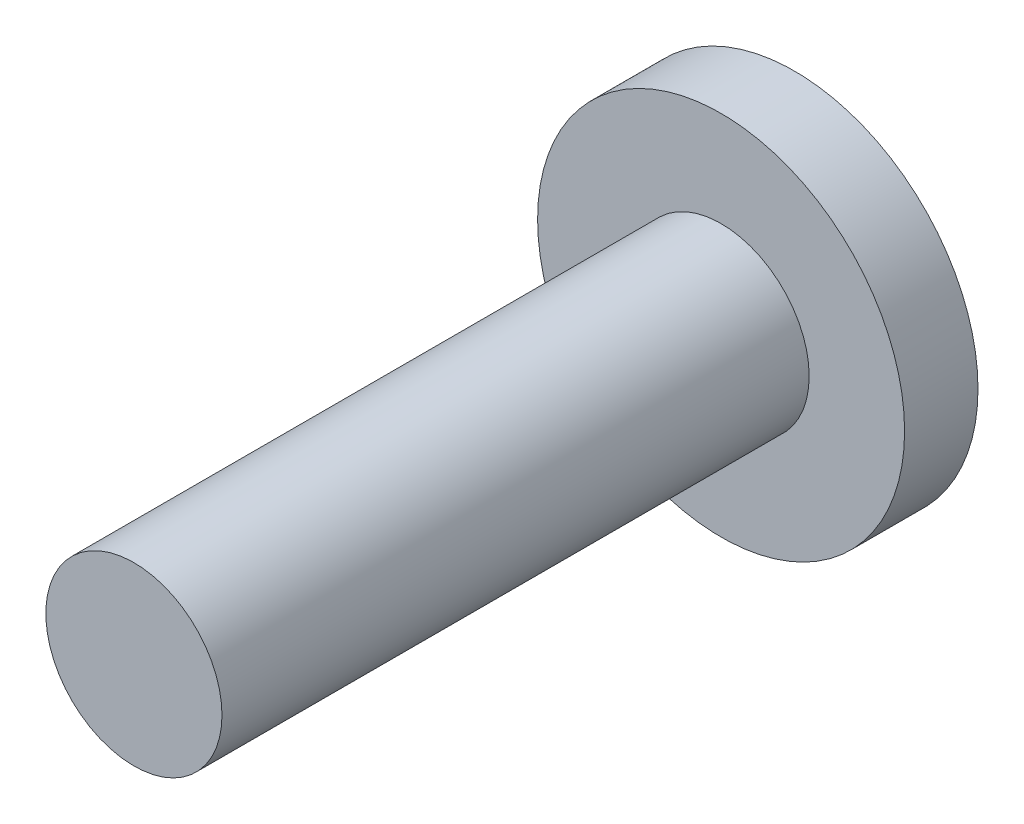
ISO-10303-21;
HEADER;
FILE_DESCRIPTION(('STEP AP214'),'2;1');
FILE_NAME('part.step','',(''),(''),'','','');
FILE_SCHEMA(('AUTOMOTIVE_DESIGN { 1 0 10303 214 1 1 1 1 }'));
ENDSEC;
DATA;
#1=APPLICATION_CONTEXT('core data for automotive mechanical design processes');
#2=APPLICATION_PROTOCOL_DEFINITION('international standard','automotive_design',2000,#1);
#3=PRODUCT_CONTEXT('',#1,'mechanical');
#4=PRODUCT('Part','Part','',(#3));
#5=PRODUCT_RELATED_PRODUCT_CATEGORY('part','',(#4));
#6=PRODUCT_DEFINITION_FORMATION('','',#4);
#7=PRODUCT_DEFINITION_CONTEXT('part definition',#1,'design');
#8=PRODUCT_DEFINITION('design','',#6,#7);
#9=PRODUCT_DEFINITION_SHAPE('','',#8);
#10=(LENGTH_UNIT() NAMED_UNIT(*) SI_UNIT(.MILLI.,.METRE.));
#11=(NAMED_UNIT(*) PLANE_ANGLE_UNIT() SI_UNIT($,.RADIAN.));
#12=(NAMED_UNIT(*) SI_UNIT($,.STERADIAN.) SOLID_ANGLE_UNIT());
#13=UNCERTAINTY_MEASURE_WITH_UNIT(LENGTH_MEASURE(1.E-05),#10,'distance_accuracy_value','');
#14=(GEOMETRIC_REPRESENTATION_CONTEXT(3) GLOBAL_UNCERTAINTY_ASSIGNED_CONTEXT((#13)) GLOBAL_UNIT_ASSIGNED_CONTEXT((#10,
#11,#12)) REPRESENTATION_CONTEXT('',''));
#15=CARTESIAN_POINT('',(0.,0.,0.));
#16=DIRECTION('',(0.,0.,1.));
#17=DIRECTION('',(1.,0.,0.));
#18=AXIS2_PLACEMENT_3D('',#15,#16,#17);
#19=CARTESIAN_POINT('',(0.,0.,2.5));
#20=DIRECTION('',(0.,0.,-1.));
#21=DIRECTION('',(-1.,0.,0.));
#22=AXIS2_PLACEMENT_3D('',#19,#20,#21);
#23=CYLINDRICAL_SURFACE('',#22,6.25);
#24=CARTESIAN_POINT('',(0.,0.,2.5));
#25=DIRECTION('',(0.,0.,1.));
#26=DIRECTION('',(1.,0.,0.));
#27=AXIS2_PLACEMENT_3D('',#24,#25,#26);
#28=CIRCLE('',#27,6.25);
#29=CARTESIAN_POINT('',(6.25,0.,2.5));
#30=VERTEX_POINT('',#29);
#31=EDGE_CURVE('E49',#30,#30,#28,.T.);
#32=ORIENTED_EDGE('',*,*,#31,.F.);
#33=EDGE_LOOP('',(#32));
#34=FACE_BOUND('',#33,.T.);
#35=CARTESIAN_POINT('',(0.,0.,0.));
#36=DIRECTION('',(0.,0.,1.));
#37=DIRECTION('',(1.,0.,0.));
#38=AXIS2_PLACEMENT_3D('',#35,#36,#37);
#39=CIRCLE('',#38,6.25);
#40=CARTESIAN_POINT('',(6.25,0.,0.));
#41=VERTEX_POINT('',#40);
#42=EDGE_CURVE('E44',#41,#41,#39,.T.);
#43=ORIENTED_EDGE('',*,*,#42,.T.);
#44=EDGE_LOOP('',(#43));
#45=FACE_BOUND('',#44,.T.);
#46=ADVANCED_FACE('F41',(#34,#45),#23,.T.);
#47=CARTESIAN_POINT('',(0.,0.,2.5));
#48=DIRECTION('',(0.,0.,1.));
#49=DIRECTION('',(1.,0.,0.));
#50=AXIS2_PLACEMENT_3D('',#47,#48,#49);
#51=PLANE('',#50);
#52=CARTESIAN_POINT('',(0.,0.,2.5));
#53=DIRECTION('',(0.,0.,1.));
#54=DIRECTION('',(1.,0.,0.));
#55=AXIS2_PLACEMENT_3D('',#52,#53,#54);
#56=CIRCLE('',#55,3.);
#57=CARTESIAN_POINT('',(3.,0.,2.5));
#58=VERTEX_POINT('',#57);
#59=EDGE_CURVE('E11',#58,#58,#56,.T.);
#60=ORIENTED_EDGE('',*,*,#59,.F.);
#61=EDGE_LOOP('',(#60));
#62=FACE_BOUND('',#61,.T.);
#63=ORIENTED_EDGE('',*,*,#31,.T.);
#64=EDGE_LOOP('',(#63));
#65=FACE_BOUND('',#64,.T.);
#66=ADVANCED_FACE('F161',(#62,#65),#51,.T.);
#67=CARTESIAN_POINT('',(0.,0.,0.));
#68=DIRECTION('',(0.,0.,1.));
#69=DIRECTION('',(1.,0.,0.));
#70=AXIS2_PLACEMENT_3D('',#67,#68,#69);
#71=PLANE('',#70);
#72=DIRECTION('',(0.5,0.866025403784439,0.));
#73=VECTOR('',#72,1.);
#74=CARTESIAN_POINT('',(-2.3094010767585,0.,0.));
#75=LINE('',#74,#73);
#76=CARTESIAN_POINT('',(-2.3094010767585,0.,0.));
#77=VERTEX_POINT('',#76);
#78=CARTESIAN_POINT('',(-1.15470053837925,2.,0.));
#79=VERTEX_POINT('',#78);
#80=EDGE_CURVE('E131',#77,#79,#75,.T.);
#81=ORIENTED_EDGE('',*,*,#80,.F.);
#82=DIRECTION('',(-0.5,0.866025403784439,0.));
#83=VECTOR('',#82,1.);
#84=CARTESIAN_POINT('',(-1.15470053837925,-2.,0.));
#85=LINE('',#84,#83);
#86=CARTESIAN_POINT('',(-1.15470053837925,-2.,0.));
#87=VERTEX_POINT('',#86);
#88=EDGE_CURVE('E57',#87,#77,#85,.T.);
#89=ORIENTED_EDGE('',*,*,#88,.F.);
#90=DIRECTION('',(-1.,0.,0.));
#91=VECTOR('',#90,1.);
#92=CARTESIAN_POINT('',(1.15470053837925,-2.,0.));
#93=LINE('',#92,#91);
#94=CARTESIAN_POINT('',(1.15470053837925,-2.,0.));
#95=VERTEX_POINT('',#94);
#96=EDGE_CURVE('E140',#95,#87,#93,.T.);
#97=ORIENTED_EDGE('',*,*,#96,.F.);
#98=DIRECTION('',(-0.5,-0.866025403784439,0.));
#99=VECTOR('',#98,1.);
#100=CARTESIAN_POINT('',(2.3094010767585,0.,0.));
#101=LINE('',#100,#99);
#102=CARTESIAN_POINT('',(2.3094010767585,0.,0.));
#103=VERTEX_POINT('',#102);
#104=EDGE_CURVE('E138',#103,#95,#101,.T.);
#105=ORIENTED_EDGE('',*,*,#104,.F.);
#106=DIRECTION('',(0.5,-0.866025403784439,0.));
#107=VECTOR('',#106,1.);
#108=CARTESIAN_POINT('',(1.15470053837925,2.,0.));
#109=LINE('',#108,#107);
#110=CARTESIAN_POINT('',(1.15470053837925,2.,0.));
#111=VERTEX_POINT('',#110);
#112=EDGE_CURVE('E105',#111,#103,#109,.T.);
#113=ORIENTED_EDGE('',*,*,#112,.F.);
#114=DIRECTION('',(1.,0.,0.));
#115=VECTOR('',#114,1.);
#116=CARTESIAN_POINT('',(-1.15470053837925,2.,0.));
#117=LINE('',#116,#115);
#118=EDGE_CURVE('E134',#79,#111,#117,.T.);
#119=ORIENTED_EDGE('',*,*,#118,.F.);
#120=EDGE_LOOP('',(#81,#89,#97,#105,#113,#119));
#121=FACE_BOUND('',#120,.T.);
#122=ORIENTED_EDGE('',*,*,#42,.F.);
#123=EDGE_LOOP('',(#122));
#124=FACE_BOUND('',#123,.T.);
#125=ADVANCED_FACE('F158',(#121,#124),#71,.F.);
#126=CARTESIAN_POINT('',(0.,0.,22.5));
#127=DIRECTION('',(0.,0.,-1.));
#128=DIRECTION('',(-1.,0.,0.));
#129=AXIS2_PLACEMENT_3D('',#126,#127,#128);
#130=CYLINDRICAL_SURFACE('',#129,3.);
#131=CARTESIAN_POINT('',(0.,0.,22.5));
#132=DIRECTION('',(0.,0.,1.));
#133=DIRECTION('',(1.,0.,0.));
#134=AXIS2_PLACEMENT_3D('',#131,#132,#133);
#135=CIRCLE('',#134,3.);
#136=CARTESIAN_POINT('',(3.,0.,22.5));
#137=VERTEX_POINT('',#136);
#138=EDGE_CURVE('E144',#137,#137,#135,.T.);
#139=ORIENTED_EDGE('',*,*,#138,.F.);
#140=EDGE_LOOP('',(#139));
#141=FACE_BOUND('',#140,.T.);
#142=ORIENTED_EDGE('',*,*,#59,.T.);
#143=EDGE_LOOP('',(#142));
#144=FACE_BOUND('',#143,.T.);
#145=ADVANCED_FACE('F160',(#141,#144),#130,.T.);
#146=CARTESIAN_POINT('',(0.,0.,22.5));
#147=DIRECTION('',(0.,0.,1.));
#148=DIRECTION('',(1.,0.,0.));
#149=AXIS2_PLACEMENT_3D('',#146,#147,#148);
#150=PLANE('',#149);
#151=ORIENTED_EDGE('',*,*,#138,.T.);
#152=EDGE_LOOP('',(#151));
#153=FACE_BOUND('',#152,.T.);
#154=ADVANCED_FACE('F168',(#153),#150,.T.);
#155=CARTESIAN_POINT('',(-1.15470053837925,-2.,1.));
#156=DIRECTION('',(-0.866025403784439,-0.5,0.));
#157=DIRECTION('',(0.5,-0.866025403784439,0.));
#158=AXIS2_PLACEMENT_3D('',#155,#156,#157);
#159=PLANE('',#158);
#160=ORIENTED_EDGE('',*,*,#88,.T.);
#161=DIRECTION('',(0.,0.,-1.));
#162=VECTOR('',#161,1.);
#163=CARTESIAN_POINT('',(-2.3094010767585,0.,1.));
#164=LINE('',#163,#162);
#165=CARTESIAN_POINT('',(-2.3094010767585,0.,1.));
#166=VERTEX_POINT('',#165);
#167=EDGE_CURVE('E87',#166,#77,#164,.T.);
#168=ORIENTED_EDGE('',*,*,#167,.F.);
#169=DIRECTION('',(-0.5,0.866025403784439,0.));
#170=VECTOR('',#169,1.);
#171=CARTESIAN_POINT('',(-1.15470053837925,-2.,1.));
#172=LINE('',#171,#170);
#173=CARTESIAN_POINT('',(-1.15470053837925,-2.,1.));
#174=VERTEX_POINT('',#173);
#175=EDGE_CURVE('E142',#174,#166,#172,.T.);
#176=ORIENTED_EDGE('',*,*,#175,.F.);
#177=DIRECTION('',(0.,0.,-1.));
#178=VECTOR('',#177,1.);
#179=CARTESIAN_POINT('',(-1.15470053837925,-2.,1.));
#180=LINE('',#179,#178);
#181=EDGE_CURVE('E65',#174,#87,#180,.T.);
#182=ORIENTED_EDGE('',*,*,#181,.T.);
#183=EDGE_LOOP('',(#160,#168,#176,#182));
#184=FACE_BOUND('',#183,.T.);
#185=ADVANCED_FACE('F194',(#184),#159,.F.);
#186=CARTESIAN_POINT('',(1.15470053837925,-2.,1.));
#187=DIRECTION('',(0.,-1.,0.));
#188=DIRECTION('',(0.,0.,-1.));
#189=AXIS2_PLACEMENT_3D('',#186,#187,#188);
#190=PLANE('',#189);
#191=ORIENTED_EDGE('',*,*,#96,.T.);
#192=ORIENTED_EDGE('',*,*,#181,.F.);
#193=DIRECTION('',(-1.,0.,0.));
#194=VECTOR('',#193,1.);
#195=CARTESIAN_POINT('',(1.15470053837925,-2.,1.));
#196=LINE('',#195,#194);
#197=CARTESIAN_POINT('',(1.15470053837925,-2.,1.));
#198=VERTEX_POINT('',#197);
#199=EDGE_CURVE('E117',#198,#174,#196,.T.);
#200=ORIENTED_EDGE('',*,*,#199,.F.);
#201=DIRECTION('',(0.,0.,-1.));
#202=VECTOR('',#201,1.);
#203=CARTESIAN_POINT('',(1.15470053837925,-2.,1.));
#204=LINE('',#203,#202);
#205=EDGE_CURVE('E109',#198,#95,#204,.T.);
#206=ORIENTED_EDGE('',*,*,#205,.T.);
#207=EDGE_LOOP('',(#191,#192,#200,#206));
#208=FACE_BOUND('',#207,.T.);
#209=ADVANCED_FACE('F206',(#208),#190,.F.);
#210=CARTESIAN_POINT('',(2.3094010767585,0.,1.));
#211=DIRECTION('',(0.866025403784439,-0.5,0.));
#212=DIRECTION('',(0.5,0.866025403784439,0.));
#213=AXIS2_PLACEMENT_3D('',#210,#211,#212);
#214=PLANE('',#213);
#215=ORIENTED_EDGE('',*,*,#104,.T.);
#216=ORIENTED_EDGE('',*,*,#205,.F.);
#217=DIRECTION('',(-0.5,-0.866025403784439,0.));
#218=VECTOR('',#217,1.);
#219=CARTESIAN_POINT('',(2.3094010767585,0.,1.));
#220=LINE('',#219,#218);
#221=CARTESIAN_POINT('',(2.3094010767585,0.,1.));
#222=VERTEX_POINT('',#221);
#223=EDGE_CURVE('E113',#222,#198,#220,.T.);
#224=ORIENTED_EDGE('',*,*,#223,.F.);
#225=DIRECTION('',(0.,0.,-1.));
#226=VECTOR('',#225,1.);
#227=CARTESIAN_POINT('',(2.3094010767585,0.,1.));
#228=LINE('',#227,#226);
#229=EDGE_CURVE('E98',#222,#103,#228,.T.);
#230=ORIENTED_EDGE('',*,*,#229,.T.);
#231=EDGE_LOOP('',(#215,#216,#224,#230));
#232=FACE_BOUND('',#231,.T.);
#233=ADVANCED_FACE('F114',(#232),#214,.F.);
#234=CARTESIAN_POINT('',(1.15470053837925,2.,1.));
#235=DIRECTION('',(0.866025403784439,0.5,0.));
#236=DIRECTION('',(-0.5,0.866025403784439,0.));
#237=AXIS2_PLACEMENT_3D('',#234,#235,#236);
#238=PLANE('',#237);
#239=ORIENTED_EDGE('',*,*,#112,.T.);
#240=ORIENTED_EDGE('',*,*,#229,.F.);
#241=DIRECTION('',(0.5,-0.866025403784439,0.));
#242=VECTOR('',#241,1.);
#243=CARTESIAN_POINT('',(1.15470053837925,2.,1.));
#244=LINE('',#243,#242);
#245=CARTESIAN_POINT('',(1.15470053837925,2.,1.));
#246=VERTEX_POINT('',#245);
#247=EDGE_CURVE('E102',#246,#222,#244,.T.);
#248=ORIENTED_EDGE('',*,*,#247,.F.);
#249=DIRECTION('',(0.,0.,-1.));
#250=VECTOR('',#249,1.);
#251=CARTESIAN_POINT('',(1.15470053837925,2.,1.));
#252=LINE('',#251,#250);
#253=EDGE_CURVE('E110',#246,#111,#252,.T.);
#254=ORIENTED_EDGE('',*,*,#253,.T.);
#255=EDGE_LOOP('',(#239,#240,#248,#254));
#256=FACE_BOUND('',#255,.T.);
#257=ADVANCED_FACE('F100',(#256),#238,.F.);
#258=CARTESIAN_POINT('',(-1.15470053837925,2.,1.));
#259=DIRECTION('',(0.,1.,0.));
#260=DIRECTION('',(-1.,0.,0.));
#261=AXIS2_PLACEMENT_3D('',#258,#259,#260);
#262=PLANE('',#261);
#263=ORIENTED_EDGE('',*,*,#118,.T.);
#264=ORIENTED_EDGE('',*,*,#253,.F.);
#265=DIRECTION('',(1.,0.,0.));
#266=VECTOR('',#265,1.);
#267=CARTESIAN_POINT('',(-1.15470053837925,2.,1.));
#268=LINE('',#267,#266);
#269=CARTESIAN_POINT('',(-1.15470053837925,2.,1.));
#270=VERTEX_POINT('',#269);
#271=EDGE_CURVE('E123',#270,#246,#268,.T.);
#272=ORIENTED_EDGE('',*,*,#271,.F.);
#273=DIRECTION('',(0.,0.,-1.));
#274=VECTOR('',#273,1.);
#275=CARTESIAN_POINT('',(-1.15470053837925,2.,1.));
#276=LINE('',#275,#274);
#277=EDGE_CURVE('E147',#270,#79,#276,.T.);
#278=ORIENTED_EDGE('',*,*,#277,.T.);
#279=EDGE_LOOP('',(#263,#264,#272,#278));
#280=FACE_BOUND('',#279,.T.);
#281=ADVANCED_FACE('F231',(#280),#262,.F.);
#282=CARTESIAN_POINT('',(-2.3094010767585,0.,1.));
#283=DIRECTION('',(-0.866025403784439,0.5,0.));
#284=DIRECTION('',(-0.5,-0.866025403784439,0.));
#285=AXIS2_PLACEMENT_3D('',#282,#283,#284);
#286=PLANE('',#285);
#287=ORIENTED_EDGE('',*,*,#80,.T.);
#288=ORIENTED_EDGE('',*,*,#277,.F.);
#289=DIRECTION('',(0.5,0.866025403784439,0.));
#290=VECTOR('',#289,1.);
#291=CARTESIAN_POINT('',(-2.3094010767585,0.,1.));
#292=LINE('',#291,#290);
#293=EDGE_CURVE('E125',#166,#270,#292,.T.);
#294=ORIENTED_EDGE('',*,*,#293,.F.);
#295=ORIENTED_EDGE('',*,*,#167,.T.);
#296=EDGE_LOOP('',(#287,#288,#294,#295));
#297=FACE_BOUND('',#296,.T.);
#298=ADVANCED_FACE('F240',(#297),#286,.F.);
#299=CARTESIAN_POINT('',(0.,0.,1.));
#300=DIRECTION('',(0.,0.,-1.));
#301=DIRECTION('',(-1.,0.,0.));
#302=AXIS2_PLACEMENT_3D('',#299,#300,#301);
#303=PLANE('',#302);
#304=ORIENTED_EDGE('',*,*,#175,.T.);
#305=ORIENTED_EDGE('',*,*,#293,.T.);
#306=ORIENTED_EDGE('',*,*,#271,.T.);
#307=ORIENTED_EDGE('',*,*,#247,.T.);
#308=ORIENTED_EDGE('',*,*,#223,.T.);
#309=ORIENTED_EDGE('',*,*,#199,.T.);
#310=EDGE_LOOP('',(#304,#305,#306,#307,#308,#309));
#311=FACE_BOUND('',#310,.T.);
#312=ADVANCED_FACE('F120',(#311),#303,.T.);
#313=CLOSED_SHELL('',(#46,#66,#125,#145,#154,#185,#209,#233,#257,#281,#298,#312));
#314=MANIFOLD_SOLID_BREP('B2',#313);
#315=ADVANCED_BREP_SHAPE_REPRESENTATION('',(#18,#314),#14);
#316=SHAPE_DEFINITION_REPRESENTATION(#9,#315);
ENDSEC;
END-ISO-10303-21;
